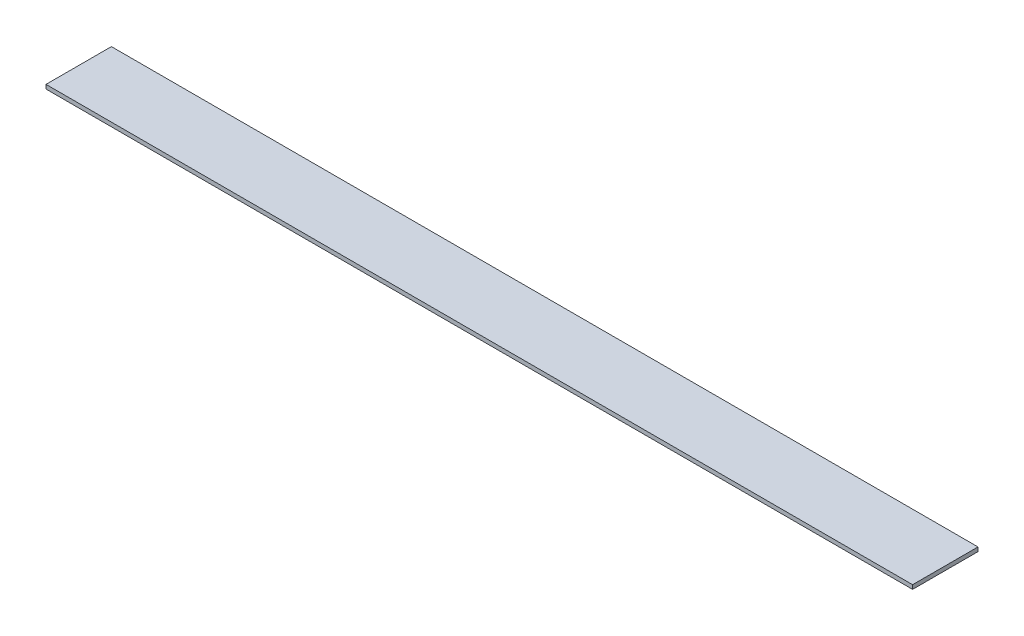
ISO-10303-21;
HEADER;
FILE_DESCRIPTION(('STEP AP214'),'2;1');
FILE_NAME('part.step','',(''),(''),'','','');
FILE_SCHEMA(('AUTOMOTIVE_DESIGN { 1 0 10303 214 1 1 1 1 }'));
ENDSEC;
DATA;
#1=APPLICATION_CONTEXT('core data for automotive mechanical design processes');
#2=APPLICATION_PROTOCOL_DEFINITION('international standard','automotive_design',2000,#1);
#3=PRODUCT_CONTEXT('',#1,'mechanical');
#4=PRODUCT('Part','Part','',(#3));
#5=PRODUCT_RELATED_PRODUCT_CATEGORY('part','',(#4));
#6=PRODUCT_DEFINITION_FORMATION('','',#4);
#7=PRODUCT_DEFINITION_CONTEXT('part definition',#1,'design');
#8=PRODUCT_DEFINITION('design','',#6,#7);
#9=PRODUCT_DEFINITION_SHAPE('','',#8);
#10=(LENGTH_UNIT() NAMED_UNIT(*) SI_UNIT(.MILLI.,.METRE.));
#11=(NAMED_UNIT(*) PLANE_ANGLE_UNIT() SI_UNIT($,.RADIAN.));
#12=(NAMED_UNIT(*) SI_UNIT($,.STERADIAN.) SOLID_ANGLE_UNIT());
#13=UNCERTAINTY_MEASURE_WITH_UNIT(LENGTH_MEASURE(1.E-05),#10,'distance_accuracy_value','');
#14=(GEOMETRIC_REPRESENTATION_CONTEXT(3) GLOBAL_UNCERTAINTY_ASSIGNED_CONTEXT((#13)) GLOBAL_UNIT_ASSIGNED_CONTEXT((#10,
#11,#12)) REPRESENTATION_CONTEXT('',''));
#15=CARTESIAN_POINT('',(0.,0.,0.));
#16=DIRECTION('',(0.,0.,1.));
#17=DIRECTION('',(1.,0.,0.));
#18=AXIS2_PLACEMENT_3D('',#15,#16,#17);
#19=CARTESIAN_POINT('',(0.,1.5875,0.));
#20=DIRECTION('',(1.,0.,0.));
#21=DIRECTION('',(0.,0.,-1.));
#22=AXIS2_PLACEMENT_3D('',#19,#20,#21);
#23=PLANE('',#22);
#24=DIRECTION('',(0.,0.,1.));
#25=VECTOR('',#24,1.);
#26=CARTESIAN_POINT('',(0.,0.,0.));
#27=LINE('',#26,#25);
#28=CARTESIAN_POINT('',(0.,0.,-25.4));
#29=VERTEX_POINT('',#28);
#30=CARTESIAN_POINT('',(0.,0.,0.));
#31=VERTEX_POINT('',#30);
#32=EDGE_CURVE('E96',#29,#31,#27,.T.);
#33=ORIENTED_EDGE('',*,*,#32,.T.);
#34=DIRECTION('',(0.,-1.,0.));
#35=VECTOR('',#34,1.);
#36=CARTESIAN_POINT('',(0.,1.5875,0.));
#37=LINE('',#36,#35);
#38=CARTESIAN_POINT('',(0.,1.5875,0.));
#39=VERTEX_POINT('',#38);
#40=EDGE_CURVE('E11',#39,#31,#37,.T.);
#41=ORIENTED_EDGE('',*,*,#40,.F.);
#42=DIRECTION('',(0.,0.,1.));
#43=VECTOR('',#42,1.);
#44=CARTESIAN_POINT('',(0.,1.5875,0.));
#45=LINE('',#44,#43);
#46=CARTESIAN_POINT('',(0.,1.5875,-25.4));
#47=VERTEX_POINT('',#46);
#48=EDGE_CURVE('E84',#47,#39,#45,.T.);
#49=ORIENTED_EDGE('',*,*,#48,.F.);
#50=DIRECTION('',(0.,-1.,0.));
#51=VECTOR('',#50,1.);
#52=CARTESIAN_POINT('',(0.,1.5875,-25.4));
#53=LINE('',#52,#51);
#54=EDGE_CURVE('E92',#47,#29,#53,.T.);
#55=ORIENTED_EDGE('',*,*,#54,.T.);
#56=EDGE_LOOP('',(#33,#41,#49,#55));
#57=FACE_BOUND('',#56,.T.);
#58=ADVANCED_FACE('F33',(#57),#23,.F.);
#59=CARTESIAN_POINT('',(0.,1.5875,0.));
#60=DIRECTION('',(0.,0.,-1.));
#61=DIRECTION('',(-1.,0.,0.));
#62=AXIS2_PLACEMENT_3D('',#59,#60,#61);
#63=PLANE('',#62);
#64=DIRECTION('',(1.,0.,0.));
#65=VECTOR('',#64,1.);
#66=CARTESIAN_POINT('',(0.,0.,0.));
#67=LINE('',#66,#65);
#68=CARTESIAN_POINT('',(336.55,0.,0.));
#69=VERTEX_POINT('',#68);
#70=EDGE_CURVE('E88',#31,#69,#67,.T.);
#71=ORIENTED_EDGE('',*,*,#70,.T.);
#72=DIRECTION('',(0.,-1.,0.));
#73=VECTOR('',#72,1.);
#74=CARTESIAN_POINT('',(336.55,1.5875,0.));
#75=LINE('',#74,#73);
#76=CARTESIAN_POINT('',(336.55,1.5875,0.));
#77=VERTEX_POINT('',#76);
#78=EDGE_CURVE('E41',#77,#69,#75,.T.);
#79=ORIENTED_EDGE('',*,*,#78,.F.);
#80=DIRECTION('',(1.,0.,0.));
#81=VECTOR('',#80,1.);
#82=CARTESIAN_POINT('',(0.,1.5875,0.));
#83=LINE('',#82,#81);
#84=EDGE_CURVE('E79',#39,#77,#83,.T.);
#85=ORIENTED_EDGE('',*,*,#84,.F.);
#86=ORIENTED_EDGE('',*,*,#40,.T.);
#87=EDGE_LOOP('',(#71,#79,#85,#86));
#88=FACE_BOUND('',#87,.T.);
#89=ADVANCED_FACE('F87',(#88),#63,.F.);
#90=CARTESIAN_POINT('',(336.55,1.5875,0.));
#91=DIRECTION('',(-1.,0.,0.));
#92=DIRECTION('',(0.,0.,1.));
#93=AXIS2_PLACEMENT_3D('',#90,#91,#92);
#94=PLANE('',#93);
#95=DIRECTION('',(0.,0.,-1.));
#96=VECTOR('',#95,1.);
#97=CARTESIAN_POINT('',(336.55,0.,0.));
#98=LINE('',#97,#96);
#99=CARTESIAN_POINT('',(336.55,0.,-25.4));
#100=VERTEX_POINT('',#99);
#101=EDGE_CURVE('E66',#69,#100,#98,.T.);
#102=ORIENTED_EDGE('',*,*,#101,.T.);
#103=DIRECTION('',(0.,-1.,0.));
#104=VECTOR('',#103,1.);
#105=CARTESIAN_POINT('',(336.55,1.5875,-25.4));
#106=LINE('',#105,#104);
#107=CARTESIAN_POINT('',(336.55,1.5875,-25.4));
#108=VERTEX_POINT('',#107);
#109=EDGE_CURVE('E89',#108,#100,#106,.T.);
#110=ORIENTED_EDGE('',*,*,#109,.F.);
#111=DIRECTION('',(0.,0.,-1.));
#112=VECTOR('',#111,1.);
#113=CARTESIAN_POINT('',(336.55,1.5875,0.));
#114=LINE('',#113,#112);
#115=EDGE_CURVE('E82',#77,#108,#114,.T.);
#116=ORIENTED_EDGE('',*,*,#115,.F.);
#117=ORIENTED_EDGE('',*,*,#78,.T.);
#118=EDGE_LOOP('',(#102,#110,#116,#117));
#119=FACE_BOUND('',#118,.T.);
#120=ADVANCED_FACE('F90',(#119),#94,.F.);
#121=CARTESIAN_POINT('',(0.,1.5875,-25.4));
#122=DIRECTION('',(0.,0.,1.));
#123=DIRECTION('',(1.,0.,0.));
#124=AXIS2_PLACEMENT_3D('',#121,#122,#123);
#125=PLANE('',#124);
#126=DIRECTION('',(-1.,0.,0.));
#127=VECTOR('',#126,1.);
#128=CARTESIAN_POINT('',(0.,0.,-25.4));
#129=LINE('',#128,#127);
#130=EDGE_CURVE('E72',#100,#29,#129,.T.);
#131=ORIENTED_EDGE('',*,*,#130,.T.);
#132=ORIENTED_EDGE('',*,*,#54,.F.);
#133=DIRECTION('',(-1.,0.,0.));
#134=VECTOR('',#133,1.);
#135=CARTESIAN_POINT('',(0.,1.5875,-25.4));
#136=LINE('',#135,#134);
#137=EDGE_CURVE('E49',#108,#47,#136,.T.);
#138=ORIENTED_EDGE('',*,*,#137,.F.);
#139=ORIENTED_EDGE('',*,*,#109,.T.);
#140=EDGE_LOOP('',(#131,#132,#138,#139));
#141=FACE_BOUND('',#140,.T.);
#142=ADVANCED_FACE('F103',(#141),#125,.F.);
#143=CARTESIAN_POINT('',(0.,1.5875,0.));
#144=DIRECTION('',(0.,-1.,0.));
#145=DIRECTION('',(0.,0.,-1.));
#146=AXIS2_PLACEMENT_3D('',#143,#144,#145);
#147=PLANE('',#146);
#148=ORIENTED_EDGE('',*,*,#48,.T.);
#149=ORIENTED_EDGE('',*,*,#84,.T.);
#150=ORIENTED_EDGE('',*,*,#115,.T.);
#151=ORIENTED_EDGE('',*,*,#137,.T.);
#152=EDGE_LOOP('',(#148,#149,#150,#151));
#153=FACE_BOUND('',#152,.T.);
#154=ADVANCED_FACE('F80',(#153),#147,.F.);
#155=CARTESIAN_POINT('',(0.,0.,0.));
#156=DIRECTION('',(0.,-1.,0.));
#157=DIRECTION('',(0.,0.,-1.));
#158=AXIS2_PLACEMENT_3D('',#155,#156,#157);
#159=PLANE('',#158);
#160=ORIENTED_EDGE('',*,*,#32,.F.);
#161=ORIENTED_EDGE('',*,*,#130,.F.);
#162=ORIENTED_EDGE('',*,*,#101,.F.);
#163=ORIENTED_EDGE('',*,*,#70,.F.);
#164=EDGE_LOOP('',(#160,#161,#162,#163));
#165=FACE_BOUND('',#164,.T.);
#166=ADVANCED_FACE('F106',(#165),#159,.T.);
#167=CLOSED_SHELL('',(#58,#89,#120,#142,#154,#166));
#168=MANIFOLD_SOLID_BREP('B2',#167);
#169=ADVANCED_BREP_SHAPE_REPRESENTATION('',(#18,#168),#14);
#170=SHAPE_DEFINITION_REPRESENTATION(#9,#169);
ENDSEC;
END-ISO-10303-21;
